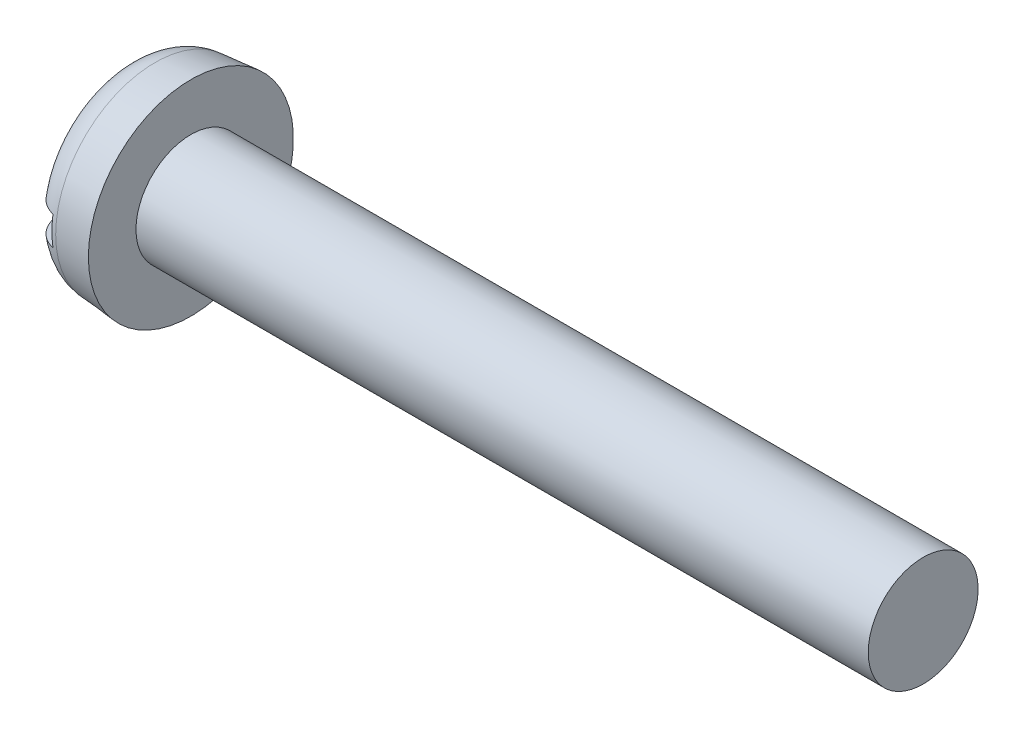
ISO-10303-21;
HEADER;
FILE_DESCRIPTION(('STEP AP214'),'2;1');
FILE_NAME('part.step','',(''),(''),'','','');
FILE_SCHEMA(('AUTOMOTIVE_DESIGN { 1 0 10303 214 1 1 1 1 }'));
ENDSEC;
DATA;
#1=APPLICATION_CONTEXT('core data for automotive mechanical design processes');
#2=APPLICATION_PROTOCOL_DEFINITION('international standard','automotive_design',2000,#1);
#3=PRODUCT_CONTEXT('',#1,'mechanical');
#4=PRODUCT('Part','Part','',(#3));
#5=PRODUCT_RELATED_PRODUCT_CATEGORY('part','',(#4));
#6=PRODUCT_DEFINITION_FORMATION('','',#4);
#7=PRODUCT_DEFINITION_CONTEXT('part definition',#1,'design');
#8=PRODUCT_DEFINITION('design','',#6,#7);
#9=PRODUCT_DEFINITION_SHAPE('','',#8);
#10=(LENGTH_UNIT() NAMED_UNIT(*) SI_UNIT(.MILLI.,.METRE.));
#11=(NAMED_UNIT(*) PLANE_ANGLE_UNIT() SI_UNIT($,.RADIAN.));
#12=(NAMED_UNIT(*) SI_UNIT($,.STERADIAN.) SOLID_ANGLE_UNIT());
#13=UNCERTAINTY_MEASURE_WITH_UNIT(LENGTH_MEASURE(1.E-05),#10,'distance_accuracy_value','');
#14=(GEOMETRIC_REPRESENTATION_CONTEXT(3) GLOBAL_UNCERTAINTY_ASSIGNED_CONTEXT((#13)) GLOBAL_UNIT_ASSIGNED_CONTEXT((#10,
#11,#12)) REPRESENTATION_CONTEXT('',''));
#15=CARTESIAN_POINT('',(0.,0.,0.));
#16=DIRECTION('',(0.,0.,1.));
#17=DIRECTION('',(1.,0.,0.));
#18=AXIS2_PLACEMENT_3D('',#15,#16,#17);
#19=CARTESIAN_POINT('',(0.,0.,0.));
#20=DIRECTION('',(-1.,0.,0.));
#21=DIRECTION('',(0.,0.,1.));
#22=AXIS2_PLACEMENT_3D('',#19,#20,#21);
#23=PLANE('',#22);
#24=DIRECTION('',(0.,0.,-1.));
#25=VECTOR('',#24,1.);
#26=CARTESIAN_POINT('',(0.,0.4,2.8));
#27=LINE('',#26,#25);
#28=CARTESIAN_POINT('',(0.,0.4,1.77326763142532));
#29=VERTEX_POINT('',#28);
#30=CARTESIAN_POINT('',(0.,0.4,-1.77326763142532));
#31=VERTEX_POINT('',#30);
#32=EDGE_CURVE('E87',#29,#31,#27,.T.);
#33=ORIENTED_EDGE('',*,*,#32,.F.);
#34=CARTESIAN_POINT('',(0.,0.,0.));
#35=DIRECTION('',(-1.,0.,0.));
#36=DIRECTION('',(0.,0.,1.));
#37=AXIS2_PLACEMENT_3D('',#34,#35,#36);
#38=CIRCLE('',#37,1.81782234903766);
#39=EDGE_CURVE('E93',#29,#31,#38,.T.);
#40=ORIENTED_EDGE('',*,*,#39,.T.);
#41=EDGE_LOOP('',(#33,#40));
#42=FACE_BOUND('',#41,.T.);
#43=ADVANCED_FACE('F34',(#42),#23,.T.);
#44=CARTESIAN_POINT('',(-25.4,0.,0.));
#45=DIRECTION('',(-1.,0.,0.));
#46=DIRECTION('',(0.,0.,1.));
#47=AXIS2_PLACEMENT_3D('',#44,#45,#46);
#48=CYLINDRICAL_SURFACE('',#47,1.5);
#49=CARTESIAN_POINT('',(21.8,0.,0.));
#50=DIRECTION('',(-1.,0.,0.));
#51=DIRECTION('',(0.,0.,1.));
#52=AXIS2_PLACEMENT_3D('',#49,#50,#51);
#53=CIRCLE('',#52,1.5);
#54=CARTESIAN_POINT('',(21.8,0.,1.5));
#55=VERTEX_POINT('',#54);
#56=EDGE_CURVE('E94',#55,#55,#53,.T.);
#57=ORIENTED_EDGE('',*,*,#56,.T.);
#58=EDGE_LOOP('',(#57));
#59=FACE_BOUND('',#58,.T.);
#60=CARTESIAN_POINT('',(1.8,0.,0.));
#61=DIRECTION('',(-1.,0.,0.));
#62=DIRECTION('',(0.,0.,1.));
#63=AXIS2_PLACEMENT_3D('',#60,#61,#62);
#64=CIRCLE('',#63,1.5);
#65=CARTESIAN_POINT('',(1.8,0.,1.5));
#66=VERTEX_POINT('',#65);
#67=EDGE_CURVE('E151',#66,#66,#64,.T.);
#68=ORIENTED_EDGE('',*,*,#67,.F.);
#69=EDGE_LOOP('',(#68));
#70=FACE_BOUND('',#69,.T.);
#71=ADVANCED_FACE('F139',(#59,#70),#48,.T.);
#72=CARTESIAN_POINT('',(21.8,1.5,0.));
#73=DIRECTION('',(1.,0.,0.));
#74=DIRECTION('',(0.,0.,-1.));
#75=AXIS2_PLACEMENT_3D('',#72,#73,#74);
#76=PLANE('',#75);
#77=ORIENTED_EDGE('',*,*,#56,.F.);
#78=EDGE_LOOP('',(#77));
#79=FACE_BOUND('',#78,.T.);
#80=ADVANCED_FACE('F137',(#79),#76,.T.);
#81=DIRECTION('',(0.,0.,1.));
#82=VECTOR('',#81,1.);
#83=CARTESIAN_POINT('',(0.,-0.4,-2.8));
#84=LINE('',#83,#82);
#85=CARTESIAN_POINT('',(0.,-0.4,-1.77326763142532));
#86=VERTEX_POINT('',#85);
#87=CARTESIAN_POINT('',(0.,-0.4,1.77326763142532));
#88=VERTEX_POINT('',#87);
#89=EDGE_CURVE('E78',#86,#88,#84,.T.);
#90=ORIENTED_EDGE('',*,*,#89,.F.);
#91=EDGE_CURVE('E85',#86,#88,#38,.T.);
#92=ORIENTED_EDGE('',*,*,#91,.T.);
#93=EDGE_LOOP('',(#90,#92));
#94=FACE_BOUND('',#93,.T.);
#95=ADVANCED_FACE('F84',(#94),#23,.T.);
#96=CARTESIAN_POINT('',(0.,0.,0.));
#97=DIRECTION('',(1.,0.,0.));
#98=DIRECTION('',(0.,0.,-1.));
#99=AXIS2_PLACEMENT_3D('',#96,#97,#98);
#100=CONICAL_SURFACE('',#99,2.64252040565334,0.0872664625997168);
#101=CARTESIAN_POINT('',(0.821559831527111,0.,0.));
#102=DIRECTION('',(-1.,0.,0.));
#103=DIRECTION('',(0.,0.,1.));
#104=AXIS2_PLACEMENT_3D('',#101,#102,#103);
#105=CIRCLE('',#104,2.71439757732023);
#106=CARTESIAN_POINT('',(0.821559831527111,0.,2.71439757732023));
#107=VERTEX_POINT('',#106);
#108=EDGE_CURVE('E97',#107,#107,#105,.F.);
#109=ORIENTED_EDGE('',*,*,#108,.T.);
#110=EDGE_LOOP('',(#109));
#111=FACE_BOUND('',#110,.T.);
#112=CARTESIAN_POINT('',(1.8,0.,0.));
#113=DIRECTION('',(-1.,0.,0.));
#114=DIRECTION('',(0.,0.,1.));
#115=AXIS2_PLACEMENT_3D('',#112,#113,#114);
#116=CIRCLE('',#115,2.8);
#117=CARTESIAN_POINT('',(1.8,0.,2.8));
#118=VERTEX_POINT('',#117);
#119=EDGE_CURVE('E99',#118,#118,#116,.T.);
#120=ORIENTED_EDGE('',*,*,#119,.T.);
#121=EDGE_LOOP('',(#120));
#122=FACE_BOUND('',#121,.T.);
#123=ADVANCED_FACE('F130',(#111,#122),#100,.T.);
#124=CARTESIAN_POINT('',(1.8,1.5,0.));
#125=DIRECTION('',(-1.,0.,0.));
#126=DIRECTION('',(0.,0.,1.));
#127=AXIS2_PLACEMENT_3D('',#124,#125,#126);
#128=PLANE('',#127);
#129=ORIENTED_EDGE('',*,*,#119,.F.);
#130=EDGE_LOOP('',(#129));
#131=FACE_BOUND('',#130,.T.);
#132=ORIENTED_EDGE('',*,*,#67,.T.);
#133=EDGE_LOOP('',(#132));
#134=FACE_BOUND('',#133,.T.);
#135=ADVANCED_FACE('F126',(#131,#134),#128,.F.);
#136=CARTESIAN_POINT('',(0.9,0.,0.));
#137=DIRECTION('',(-1.,0.,0.));
#138=DIRECTION('',(0.,0.,1.));
#139=AXIS2_PLACEMENT_3D('',#136,#137,#138);
#140=TOROIDAL_SURFACE('',#139,1.81782234903766,0.9);
#141=CARTESIAN_POINT('',(0.401696093511728,0.4,-2.53593152114129));
#142=CARTESIAN_POINT('',(0.443301117774009,0.4,-2.56393332788218));
#143=CARTESIAN_POINT('',(0.48728921147468,0.4,-2.58845843023252));
#144=CARTESIAN_POINT('',(0.578792425576941,0.4,-2.62980192456992));
#145=CARTESIAN_POINT('',(0.626311517541325,0.4,-2.64661148109401));
#146=CARTESIAN_POINT('',(0.723491694345221,0.4,-2.67199528317045));
#147=CARTESIAN_POINT('',(0.77315217005018,0.4,-2.6805718547261));
#148=CARTESIAN_POINT('',(0.873195470603058,0.4,-2.68923740018578));
#149=CARTESIAN_POINT('',(0.923578118909892,0.4,-2.68932841422142));
#150=CARTESIAN_POINT('',(1.02350797374872,0.4,-2.68103738118982));
#151=CARTESIAN_POINT('',(1.07305702227845,0.4,-2.67267751789981));
#152=CARTESIAN_POINT('',(1.17005159771854,0.4,-2.64776531442094));
#153=CARTESIAN_POINT('',(1.21749706154432,0.4,-2.63121272872072));
#154=CARTESIAN_POINT('',(1.30899463227735,0.4,-2.59038229907007));
#155=CARTESIAN_POINT('',(1.35304326494453,0.4,-2.5660966726896));
#156=CARTESIAN_POINT('',(1.43646971838795,0.4,-2.51051742624853));
#157=CARTESIAN_POINT('',(1.47584746170715,0.4,-2.47922368999777));
#158=CARTESIAN_POINT('',(1.54908472891299,0.4,-2.41032419236434));
#159=CARTESIAN_POINT('',(1.58290894495081,0.4,-2.37268091273685));
#160=CARTESIAN_POINT('',(1.64384285536696,0.4,-2.29230689336045));
#161=CARTESIAN_POINT('',(1.67095227126419,0.4,-2.24957594272072));
#162=CARTESIAN_POINT('',(1.71804431058735,0.4,-2.15971237578418));
#163=CARTESIAN_POINT('',(1.73793948776457,0.4,-2.11253395536871));
#164=CARTESIAN_POINT('',(1.76968090770725,0.4,-2.01554593245493));
#165=CARTESIAN_POINT('',(1.78152655521718,0.4,-1.96573613566218));
#166=CARTESIAN_POINT('',(1.79707863209083,0.4,-1.86394560462762));
#167=CARTESIAN_POINT('',(1.80063474217523,0.4,-1.81194193297292));
#168=CARTESIAN_POINT('',(1.79917918253395,0.4,-1.70805700113295));
#169=CARTESIAN_POINT('',(1.79416652473772,0.4,-1.65617575575555));
#170=CARTESIAN_POINT('',(1.7755943642346,0.4,-1.55269446133053));
#171=CARTESIAN_POINT('',(1.76183474132893,0.4,-1.50113034177219));
#172=CARTESIAN_POINT('',(1.72605722331735,0.4,-1.40095096381718));
#173=CARTESIAN_POINT('',(1.70403814128862,0.4,-1.35233613041373));
#174=CARTESIAN_POINT('',(1.65177086981811,0.4,-1.25824022538735));
#175=CARTESIAN_POINT('',(1.62134113345016,0.4,-1.21285988807693));
#176=CARTESIAN_POINT('',(1.55331109595649,0.4,-1.12780932458797));
#177=CARTESIAN_POINT('',(1.51570875984687,0.4,-1.08814072454133));
#178=CARTESIAN_POINT('',(1.43418773757712,0.4,-1.01571120097083));
#179=CARTESIAN_POINT('',(1.39025557046043,0.4,-0.982965398150426));
#180=CARTESIAN_POINT('',(1.29725173640542,0.4,-0.925820211344956));
#181=CARTESIAN_POINT('',(1.24818246394632,0.4,-0.901416961201436));
#182=CARTESIAN_POINT('',(1.1492196326343,0.4,-0.863395366502829));
#183=CARTESIAN_POINT('',(1.09953332116632,0.4,-0.849240526280142));
#184=CARTESIAN_POINT('',(0.998407326739823,0.4,-0.830450847570662));
#185=CARTESIAN_POINT('',(0.946969290105793,0.4,-0.825807308120568));
#186=CARTESIAN_POINT('',(0.84892872096548,0.4,-0.826338661096803));
#187=CARTESIAN_POINT('',(0.802319233875119,0.4,-0.830644672645143));
#188=CARTESIAN_POINT('',(0.710503550748047,0.4,-0.847082675101284));
#189=CARTESIAN_POINT('',(0.665297586491216,0.4,-0.859215951485934));
#190=CARTESIAN_POINT('',(0.577725921687515,0.4,-0.890561229701253));
#191=CARTESIAN_POINT('',(0.535345451357801,0.4,-0.909732336345551));
#192=CARTESIAN_POINT('',(0.454039585142496,0.4,-0.954356114786257));
#193=CARTESIAN_POINT('',(0.415115190169609,0.4,-0.979810598293163));
#194=CARTESIAN_POINT('',(0.338258283652574,0.4,-1.03863563377017));
#195=CARTESIAN_POINT('',(0.300704584388947,0.4,-1.07250127234658));
#196=CARTESIAN_POINT('',(0.231340396591253,0.4,-1.14567873524743));
#197=CARTESIAN_POINT('',(0.199531837361427,0.4,-1.1849923812911));
#198=CARTESIAN_POINT('',(0.140343537062657,0.4,-1.27100479329441));
#199=CARTESIAN_POINT('',(0.113435239263175,0.4,-1.31802904125808));
#200=CARTESIAN_POINT('',(0.0677697881199934,0.4,-1.41588613859262));
#201=CARTESIAN_POINT('',(0.0490135480549559,0.4,-1.466719413943));
#202=CARTESIAN_POINT('',(0.0200605085740848,0.4,-1.57150752749652));
#203=CARTESIAN_POINT('',(0.00998112078324489,0.4,-1.62549494001755));
#204=CARTESIAN_POINT('',(-0.000774459474645484,0.4,-1.73439964710515));
#205=CARTESIAN_POINT('',(-0.00145178031293717,0.4,-1.78931682929512));
#206=CARTESIAN_POINT('',(0.00665978805998371,0.4,-1.8973585349181));
#207=CARTESIAN_POINT('',(0.0152619165789972,0.4,-1.95049703954292));
#208=CARTESIAN_POINT('',(0.0415044362784365,0.4,-2.05451158025993));
#209=CARTESIAN_POINT('',(0.0591459771853456,0.4,-2.10538732765632));
#210=CARTESIAN_POINT('',(0.102479617855353,0.4,-2.20207106255329));
#211=CARTESIAN_POINT('',(0.127962009730159,0.4,-2.24797321246302));
#212=CARTESIAN_POINT('',(0.186405952526769,0.4,-2.3346826673761));
#213=CARTESIAN_POINT('',(0.219357119954585,0.4,-2.37549692488183));
#214=CARTESIAN_POINT('',(0.2776517991716,0.4,-2.43611780517026));
#215=CARTESIAN_POINT('',(0.300961246504243,0.4,-2.45791602542563));
#216=CARTESIAN_POINT('',(0.349758108963351,0.4,-2.49892172941219));
#217=CARTESIAN_POINT('',(0.375245501851939,0.4,-2.51812923959063));
#218=CARTESIAN_POINT('',(0.401696093511728,0.4,-2.53593152114129));
#219=B_SPLINE_CURVE_WITH_KNOTS('',3,(#141,#142,#143,#144,#145,#146,#147,#148,#149,#150,#151,
#152,#153,#154,#155,#156,#157,#158,#159,#160,#161,#162,#163,#164,#165,#166,#167,#168,#169,#170,
#171,#172,#173,#174,#175,#176,#177,#178,#179,#180,#181,#182,#183,#184,#185,#186,#187,#188,#189,
#190,#191,#192,#193,#194,#195,#196,#197,#198,#199,#200,#201,#202,#203,#204,#205,#206,#207,#208,
#209,#210,#211,#212,#213,#214,#215,#216,#217,#218),.UNSPECIFIED.,.T.,.F.,(4,2,2,2,2,2,2,2,2,2,2,
2,2,2,2,2,2,2,2,2,2,2,2,2,2,2,2,2,2,2,2,2,2,2,2,2,2,2,4),(0.,0.150335933494514,
0.300843597394242,0.451308726970357,0.601737681026104,0.751772777865598,0.901812371080131,
1.05200344195132,1.20219700308282,1.35331128753966,1.50443183806961,1.65732734739064,
1.81023416196794,1.96589285940572,2.1215695071664,2.28094272743601,2.44033885916066,
2.60348795607714,2.76668341009569,2.93023171311279,3.09370412047096,3.24783730341248,
3.40182942181944,3.5415702699926,3.68133407374162,3.82029827564248,3.95930259253055,
4.11036263383425,4.26147330942957,4.42325618279747,4.58505717610391,4.74901464634026,
4.9129524393615,5.07365129317271,5.23437059141101,5.39111839087745,5.54764959339694,
5.64322735248863,5.73880413580184),.UNSPECIFIED.);
#220=CARTESIAN_POINT('',(0.7,0.4,-2.66547244738019));
#221=VERTEX_POINT('',#220);
#222=EDGE_CURVE('E11',#31,#221,#219,.T.);
#223=ORIENTED_EDGE('',*,*,#222,.F.);
#224=ORIENTED_EDGE('',*,*,#39,.F.);
#225=CARTESIAN_POINT('',(0.631175220468883,0.4,0.871495981540627));
#226=CARTESIAN_POINT('',(0.674904543341188,0.4,0.856438796500031));
#227=CARTESIAN_POINT('',(0.719878263159747,0.4,0.844929838444239));
#228=CARTESIAN_POINT('',(0.811135722097473,0.4,0.829645582358335));
#229=CARTESIAN_POINT('',(0.857419653490011,0.4,0.82587142543657));
#230=CARTESIAN_POINT('',(0.949967657712768,0.4,0.826292946243278));
#231=CARTESIAN_POINT('',(0.996231718998188,0.4,0.830491246695725));
#232=CARTESIAN_POINT('',(1.08739120729822,0.4,0.846603737630664));
#233=CARTESIAN_POINT('',(1.13228633060722,0.4,0.858519627443414));
#234=CARTESIAN_POINT('',(1.21961165117638,0.4,0.889449471124122));
#235=CARTESIAN_POINT('',(1.26203829733493,0.4,0.908473372222466));
#236=CARTESIAN_POINT('',(1.34345634110222,0.4,0.952815473313927));
#237=CARTESIAN_POINT('',(1.38244667242382,0.4,0.978135617780085));
#238=CARTESIAN_POINT('',(1.4594377621541,0.4,1.03667706350997));
#239=CARTESIAN_POINT('',(1.49706398720202,0.4,1.07039108297028));
#240=CARTESIAN_POINT('',(1.56659895295035,0.4,1.14327535241885));
#241=CARTESIAN_POINT('',(1.59850581805068,0.4,1.18244738484377));
#242=CARTESIAN_POINT('',(1.65794109406934,0.4,1.26820361081833));
#243=CARTESIAN_POINT('',(1.68499616118368,0.4,1.31511693869777));
#244=CARTESIAN_POINT('',(1.73097615311023,0.4,1.41277630231542));
#245=CARTESIAN_POINT('',(1.74990014079754,0.4,1.46352277904048));
#246=CARTESIAN_POINT('',(1.77921631303595,0.4,1.56819037296415));
#247=CARTESIAN_POINT('',(1.78948692404479,0.4,1.62214568122431));
#248=CARTESIAN_POINT('',(1.80062989577949,0.4,1.73102148257415));
#249=CARTESIAN_POINT('',(1.80150300404476,0.4,1.78594189854469));
#250=CARTESIAN_POINT('',(1.79377570144154,0.4,1.89403950300678));
#251=CARTESIAN_POINT('',(1.78535947623962,0.4,1.94722981003804));
#252=CARTESIAN_POINT('',(1.75948035152466,0.4,2.05136420293336));
#253=CARTESIAN_POINT('',(1.74201866082191,0.4,2.10230858794919));
#254=CARTESIAN_POINT('',(1.69903294428936,0.4,2.1991365537311));
#255=CARTESIAN_POINT('',(1.67372338322898,0.4,2.24511537218269));
#256=CARTESIAN_POINT('',(1.61559302758182,0.4,2.33205182310155));
#257=CARTESIAN_POINT('',(1.58277310246186,0.4,2.37301003595672));
#258=CARTESIAN_POINT('',(1.51127974813898,0.4,2.44787841079591));
#259=CARTESIAN_POINT('',(1.47273752290481,0.4,2.48191390856888));
#260=CARTESIAN_POINT('',(1.39041996071933,0.4,2.54292499319193));
#261=CARTESIAN_POINT('',(1.34664504043414,0.4,2.5699011416151));
#262=CARTESIAN_POINT('',(1.25574182443869,0.4,2.61566191750627));
#263=CARTESIAN_POINT('',(1.20866632391598,0.4,2.63455146707593));
#264=CARTESIAN_POINT('',(1.11199802813735,0.4,2.66409285611721));
#265=CARTESIAN_POINT('',(1.06240535215686,0.4,2.67474508552361));
#266=CARTESIAN_POINT('',(0.962502526653357,0.4,2.68744471269732));
#267=CARTESIAN_POINT('',(0.912200346253432,0.4,2.68955487726819));
#268=CARTESIAN_POINT('',(0.811958811975336,0.4,2.68528081529453));
#269=CARTESIAN_POINT('',(0.762019450666034,0.4,2.67889676322146));
#270=CARTESIAN_POINT('',(0.664027531989639,0.4,2.65784627208927));
#271=CARTESIAN_POINT('',(0.615971279375599,0.4,2.643197022474));
#272=CARTESIAN_POINT('',(0.522990210676872,0.4,2.60606123058607));
#273=CARTESIAN_POINT('',(0.478065406672589,0.4,2.58357465808084));
#274=CARTESIAN_POINT('',(0.392472109536808,0.4,2.53134616302211));
#275=CARTESIAN_POINT('',(0.351816515703728,0.4,2.50158310815031));
#276=CARTESIAN_POINT('',(0.276029509997113,0.4,2.4357048513604));
#277=CARTESIAN_POINT('',(0.240898244430083,0.4,2.39958948126101));
#278=CARTESIAN_POINT('',(0.176835333350468,0.4,2.32172709740984));
#279=CARTESIAN_POINT('',(0.147956836829552,0.4,2.27993636985612));
#280=CARTESIAN_POINT('',(0.0975151321071609,0.4,2.19215427977415));
#281=CARTESIAN_POINT('',(0.0759523258739369,0.4,2.14616268660111));
#282=CARTESIAN_POINT('',(0.0404117526562702,0.4,2.05060031814039));
#283=CARTESIAN_POINT('',(0.0265449840419457,0.4,2.00098828619734));
#284=CARTESIAN_POINT('',(0.00715737687929584,0.4,1.90016214005584));
#285=CARTESIAN_POINT('',(0.00163730520276083,0.4,1.84894787909014));
#286=CARTESIAN_POINT('',(-0.00103646856464831,0.4,1.74525626284435));
#287=CARTESIAN_POINT('',(0.00198298502720431,0.4,1.692774471539));
#288=CARTESIAN_POINT('',(0.0165672576861163,0.4,1.5890162459782));
#289=CARTESIAN_POINT('',(0.0281327748436754,0.4,1.53773991054426));
#290=CARTESIAN_POINT('',(0.0597928723844844,0.4,1.43649219995258));
#291=CARTESIAN_POINT('',(0.0800919231210289,0.4,1.3865847552086));
#292=CARTESIAN_POINT('',(0.128628670781471,0.4,1.29076759544655));
#293=CARTESIAN_POINT('',(0.156870001205797,0.4,1.2448597228063));
#294=CARTESIAN_POINT('',(0.221149361739103,0.4,1.15746425330815));
#295=CARTESIAN_POINT('',(0.257329693538453,0.4,1.11608124200677));
#296=CARTESIAN_POINT('',(0.33619903186313,0.4,1.04011285475969));
#297=CARTESIAN_POINT('',(0.378880772489415,0.4,1.00551998779309));
#298=CARTESIAN_POINT('',(0.456345744826249,0.4,0.953377181098868));
#299=CARTESIAN_POINT('',(0.489781510585734,0.4,0.933802963989649));
#300=CARTESIAN_POINT('',(0.558913558209207,0.4,0.899158166013482));
#301=CARTESIAN_POINT('',(0.594609343085406,0.4,0.884086599134742));
#302=CARTESIAN_POINT('',(0.631175220468883,0.4,0.871495981540627));
#303=B_SPLINE_CURVE_WITH_KNOTS('',3,(#225,#226,#227,#228,#229,#230,#231,#232,#233,#234,#235,
#236,#237,#238,#239,#240,#241,#242,#243,#244,#245,#246,#247,#248,#249,#250,#251,#252,#253,#254,
#255,#256,#257,#258,#259,#260,#261,#262,#263,#264,#265,#266,#267,#268,#269,#270,#271,#272,#273,
#274,#275,#276,#277,#278,#279,#280,#281,#282,#283,#284,#285,#286,#287,#288,#289,#290,#291,#292,
#293,#294,#295,#296,#297,#298,#299,#300,#301,#302),.UNSPECIFIED.,.T.,.F.,(4,2,2,2,2,2,2,2,2,2,2,
2,2,2,2,2,2,2,2,2,2,2,2,2,2,2,2,2,2,2,2,2,2,2,2,2,2,2,4),(0.,0.138615612916103,
0.277251674198893,0.415933350916858,0.554645574236207,0.693552648422647,0.832502674767945,
0.983421485118331,1.13438969741741,1.29610427307938,1.45783748170807,1.62180673071881,
1.78576293643649,1.94652574714201,2.10726707950299,2.2639540446038,2.42062287939072,
2.57413636036031,2.72763762557716,2.87908198292273,3.03051917082038,3.18084156107108,
3.33116086374289,3.4811686879926,3.63117709090574,3.78162643331956,3.93207975956823,
4.08376569017546,4.23545995397545,4.38928870771081,4.54313159395465,4.70011617891189,
4.85711358867004,5.01800577434983,5.17897168640495,5.34310060642745,5.50704742574204,
5.62298136153755,5.73888989092701),.UNSPECIFIED.);
#304=CARTESIAN_POINT('',(0.7,0.4,2.66547244738019));
#305=VERTEX_POINT('',#304);
#306=EDGE_CURVE('E111',#305,#29,#303,.T.);
#307=ORIENTED_EDGE('',*,*,#306,.F.);
#308=CARTESIAN_POINT('',(0.7,0.,0.));
#309=DIRECTION('',(-1.,0.,0.));
#310=DIRECTION('',(0.,0.,1.));
#311=AXIS2_PLACEMENT_3D('',#308,#309,#310);
#312=CIRCLE('',#311,2.69531878777687);
#313=CARTESIAN_POINT('',(0.7,-0.4,2.66547244738019));
#314=VERTEX_POINT('',#313);
#315=EDGE_CURVE('E105',#305,#314,#312,.F.);
#316=ORIENTED_EDGE('',*,*,#315,.T.);
#317=CARTESIAN_POINT('',(0.631175220468883,-0.4,0.871495981540627));
#318=CARTESIAN_POINT('',(0.582440056051627,-0.4,0.888281741940888));
#319=CARTESIAN_POINT('',(0.535174963055644,-0.4,0.909503716497946));
#320=CARTESIAN_POINT('',(0.444903467512748,-0.4,0.959728629210835));
#321=CARTESIAN_POINT('',(0.401907569369314,-0.4,0.988750138784298));
#322=CARTESIAN_POINT('',(0.32139933187422,-0.4,1.05330679583531));
#323=CARTESIAN_POINT('',(0.283866824101226,-0.4,1.08881683540862));
#324=CARTESIAN_POINT('',(0.214947035166147,-0.4,1.16532583126717));
#325=CARTESIAN_POINT('',(0.183557026279774,-0.4,1.20632233747312));
#326=CARTESIAN_POINT('',(0.126173306630207,-0.4,1.29499806178717));
#327=CARTESIAN_POINT('',(0.100543812186154,-0.4,1.34291357063032));
#328=CARTESIAN_POINT('',(0.0575990442880277,-0.4,1.44234685085245));
#329=CARTESIAN_POINT('',(0.0402853165841816,-0.4,1.4938652899135));
#330=CARTESIAN_POINT('',(0.0144295468099868,-0.4,1.59957722380881));
#331=CARTESIAN_POINT('',(0.00597091020770669,-0.4,1.65379120331088));
#332=CARTESIAN_POINT('',(-0.00151505119498231,-0.4,1.76286943896087));
#333=CARTESIAN_POINT('',(-0.000543260661566268,-0.4,1.81773363362998));
#334=CARTESIAN_POINT('',(0.0108063117868816,-0.4,1.92531903415647));
#335=CARTESIAN_POINT('',(0.0209864254781905,-0.4,1.97806105250491));
#336=CARTESIAN_POINT('',(0.0502872770681116,-0.4,2.08100191154855));
#337=CARTESIAN_POINT('',(0.0694067748926924,-0.4,2.13120110391516));
#338=CARTESIAN_POINT('',(0.115513806824551,-0.4,2.22629801812597));
#339=CARTESIAN_POINT('',(0.14229288611334,-0.4,2.27129684027619));
#340=CARTESIAN_POINT('',(0.203167661896693,-0.4,2.35603997582291));
#341=CARTESIAN_POINT('',(0.237262555060448,-0.4,2.39578486536653));
#342=CARTESIAN_POINT('',(0.31107215015185,-0.4,2.46808210682477));
#343=CARTESIAN_POINT('',(0.350664393955093,-0.4,2.50075952492731));
#344=CARTESIAN_POINT('',(0.43483240572609,-0.4,2.55890052234819));
#345=CARTESIAN_POINT('',(0.479407789016665,-0.4,2.5843646579657));
#346=CARTESIAN_POINT('',(0.571659032279254,-0.4,2.62702917155574));
#347=CARTESIAN_POINT('',(0.61928802255602,-0.4,2.64433093880064));
#348=CARTESIAN_POINT('',(0.716785744822632,-0.4,2.67063086398603));
#349=CARTESIAN_POINT('',(0.766654377625563,-0.4,2.67962938927216));
#350=CARTESIAN_POINT('',(0.866851086765478,-0.4,2.68902063968356));
#351=CARTESIAN_POINT('',(0.917173710289189,-0.4,2.68947163706794));
#352=CARTESIAN_POINT('',(1.01717730229027,-0.4,2.68190382365889));
#353=CARTESIAN_POINT('',(1.06685828235616,-0.4,2.67388516605054));
#354=CARTESIAN_POINT('',(1.16408913364714,-0.4,2.64963561785688));
#355=CARTESIAN_POINT('',(1.21164224901621,-0.4,2.63341772685543));
#356=CARTESIAN_POINT('',(1.30336357324319,-0.4,2.5932548985632));
#357=CARTESIAN_POINT('',(1.34753176252252,-0.4,2.56930991658271));
#358=CARTESIAN_POINT('',(1.43140121230963,-0.4,2.51429882511239));
#359=CARTESIAN_POINT('',(1.47108662202344,-0.4,2.48320855787322));
#360=CARTESIAN_POINT('',(1.54472936336671,-0.4,2.41485918396244));
#361=CARTESIAN_POINT('',(1.57868652408327,-0.4,2.37759989329229));
#362=CARTESIAN_POINT('',(1.64024044205203,-0.4,2.29763356977095));
#363=CARTESIAN_POINT('',(1.66777905671271,-0.4,2.2548817982485));
#364=CARTESIAN_POINT('',(1.71540533966796,-0.4,2.16541487025925));
#365=CARTESIAN_POINT('',(1.73549258796614,-0.4,2.11869949056591));
#366=CARTESIAN_POINT('',(1.76797944190081,-0.4,2.02190542768205));
#367=CARTESIAN_POINT('',(1.78026184844694,-0.4,1.97178743470805));
#368=CARTESIAN_POINT('',(1.79642443017794,-0.4,1.87021727726405));
#369=CARTESIAN_POINT('',(1.80030382576996,-0.4,1.81876498945237));
#370=CARTESIAN_POINT('',(1.79965225810416,-0.4,1.71483495243173));
#371=CARTESIAN_POINT('',(1.79494304519989,-0.4,1.66235834857244));
#372=CARTESIAN_POINT('',(1.77700429154566,-0.4,1.55888409709202));
#373=CARTESIAN_POINT('',(1.76377367047763,-0.4,1.50788663784912));
#374=CARTESIAN_POINT('',(1.72880303252309,-0.4,1.40746214507163));
#375=CARTESIAN_POINT('',(1.7068583172022,-0.4,1.35810636780321));
#376=CARTESIAN_POINT('',(1.6551362081094,-0.4,1.2636760290119));
#377=CARTESIAN_POINT('',(1.62535713115486,-0.4,1.21860239032601));
#378=CARTESIAN_POINT('',(1.55817582249343,-0.4,1.13325277423327));
#379=CARTESIAN_POINT('',(1.52065002148733,-0.4,1.09307386688499));
#380=CARTESIAN_POINT('',(1.43925099604233,-0.4,1.01972901550195));
#381=CARTESIAN_POINT('',(1.39537733695676,-0.4,0.986563552070545));
#382=CARTESIAN_POINT('',(1.30343025383384,-0.4,0.929222350042134));
#383=CARTESIAN_POINT('',(1.25547156560025,-0.4,0.904863533629853));
#384=CARTESIAN_POINT('',(1.15587516450286,-0.4,0.865408006374134));
#385=CARTESIAN_POINT('',(1.10423998181313,-0.4,0.850304993129927));
#386=CARTESIAN_POINT('',(1.00351728354306,-0.4,0.831235729727251));
#387=CARTESIAN_POINT('',(0.954588162116058,-0.4,0.826429393731615));
#388=CARTESIAN_POINT('',(0.856720563885967,-0.4,0.825757597618513));
#389=CARTESIAN_POINT('',(0.80778225521716,-0.4,0.8298764112406));
#390=CARTESIAN_POINT('',(0.737839755845568,-0.4,0.842103164129609));
#391=CARTESIAN_POINT('',(0.716186869313665,-0.4,0.846800488735406));
#392=CARTESIAN_POINT('',(0.673323995455611,-0.4,0.857891117601622));
#393=CARTESIAN_POINT('',(0.652113925657395,-0.4,0.86428410295996));
#394=CARTESIAN_POINT('',(0.631175220468883,-0.4,0.871495981540627));
#395=B_SPLINE_CURVE_WITH_KNOTS('',3,(#317,#318,#319,#320,#321,#322,#323,#324,#325,#326,#327,
#328,#329,#330,#331,#332,#333,#334,#335,#336,#337,#338,#339,#340,#341,#342,#343,#344,#345,#346,
#347,#348,#349,#350,#351,#352,#353,#354,#355,#356,#357,#358,#359,#360,#361,#362,#363,#364,#365,
#366,#367,#368,#369,#370,#371,#372,#373,#374,#375,#376,#377,#378,#379,#380,#381,#382,#383,#384,
#385,#386,#387,#388,#389,#390,#391,#392,#393,#394),.UNSPECIFIED.,.T.,.F.,(4,2,2,2,2,2,2,2,2,2,2,
2,2,2,2,2,2,2,2,2,2,2,2,2,2,2,2,2,2,2,2,2,2,2,2,2,2,2,4),(0.,0.154545929505514,
0.309463158544145,0.463793151236126,0.618054453677577,0.780314715588444,0.942605127077751,
1.10641075199289,1.27020101048904,1.43055663497239,1.59089002147255,1.74721863073234,
1.90353008272413,2.05679554725431,2.2100491885017,2.3613455070347,2.51263513171131,
2.66289297461213,2.81314809994484,2.96316574487772,3.11318425745476,3.26371763526343,
3.41425550371989,3.56610818035137,3.71796941486144,3.87206025933959,4.02616539904814,
4.18350533199931,4.3408652159535,4.50216376271748,4.66349699219782,4.82763600715278,
4.99178626625811,5.15229563882414,5.31269559661531,5.45941323508264,5.6058725648985,
5.67228456882568,5.73868409152545),.UNSPECIFIED.);
#396=EDGE_CURVE('E92',#88,#314,#395,.T.);
#397=ORIENTED_EDGE('',*,*,#396,.F.);
#398=ORIENTED_EDGE('',*,*,#91,.F.);
#399=CARTESIAN_POINT('',(0.401696093511728,-0.4,-2.53593152114129));
#400=CARTESIAN_POINT('',(0.359499569861718,-0.4,-2.50752594853869));
#401=CARTESIAN_POINT('',(0.319690458635452,-0.4,-2.47549983982046));
#402=CARTESIAN_POINT('',(0.246006645656666,-0.4,-2.40516587836491));
#403=CARTESIAN_POINT('',(0.212140132740978,-0.4,-2.36684949616946));
#404=CARTESIAN_POINT('',(0.151336229791143,-0.4,-2.28512812362888));
#405=CARTESIAN_POINT('',(0.124391330893495,-0.4,-2.24172872264131));
#406=CARTESIAN_POINT('',(0.0780875903765085,-0.4,-2.15107708021563));
#407=CARTESIAN_POINT('',(0.0587267801703001,-0.4,-2.10382584244335));
#408=CARTESIAN_POINT('',(0.0278574989581019,-0.4,-2.00623443962711));
#409=CARTESIAN_POINT('',(0.016440901453291,-0.4,-1.95586524023863));
#410=CARTESIAN_POINT('',(0.00203581031766626,-0.4,-1.85393618870856));
#411=CARTESIAN_POINT('',(-0.000951523403916868,-0.4,-1.80237617368877));
#412=CARTESIAN_POINT('',(0.00150541182221353,-0.4,-1.69835894015113));
#413=CARTESIAN_POINT('',(0.00713078743956859,-0.4,-1.64590602749594));
#414=CARTESIAN_POINT('',(0.0268851706508874,-0.4,-1.54262865024755));
#415=CARTESIAN_POINT('',(0.0410152341853257,-0.4,-1.49180438869281));
#416=CARTESIAN_POINT('',(0.0777693985439923,-0.4,-1.39187524119994));
#417=CARTESIAN_POINT('',(0.100597428420281,-0.4,-1.34284532896703));
#418=CARTESIAN_POINT('',(0.154028665500749,-0.4,-1.24921236961778));
#419=CARTESIAN_POINT('',(0.184633577370676,-0.4,-1.20461029605316));
#420=CARTESIAN_POINT('',(0.253369835088766,-0.4,-1.12040413132917));
#421=CARTESIAN_POINT('',(0.291615661801268,-0.4,-1.08089328983157));
#422=CARTESIAN_POINT('',(0.374350758887981,-0.4,-1.00902344925026));
#423=CARTESIAN_POINT('',(0.418840522733276,-0.4,-0.976665015956932));
#424=CARTESIAN_POINT('',(0.511731904475918,-0.4,-0.921153761550259));
#425=CARTESIAN_POINT('',(0.56000602416032,-0.4,-0.897788688316841));
#426=CARTESIAN_POINT('',(0.660033558527157,-0.4,-0.860397113393027));
#427=CARTESIAN_POINT('',(0.711783369409339,-0.4,-0.846361098476873));
#428=CARTESIAN_POINT('',(0.812389224940536,-0.4,-0.829368295388297));
#429=CARTESIAN_POINT('',(0.861099258735353,-0.4,-0.825545352440831));
#430=CARTESIAN_POINT('',(0.958405899151309,-0.4,-0.826719597327248));
#431=CARTESIAN_POINT('',(1.00700253299767,-0.4,-0.831714388722303));
#432=CARTESIAN_POINT('',(1.0996760197852,-0.4,-0.84962330141339));
#433=CARTESIAN_POINT('',(1.14384950549969,-0.4,-0.862046867571478));
#434=CARTESIAN_POINT('',(1.22966211525765,-0.4,-0.89374221784771));
#435=CARTESIAN_POINT('',(1.27130051154861,-0.4,-0.913015957700824));
#436=CARTESIAN_POINT('',(1.35338723347829,-0.4,-0.958876506944367));
#437=CARTESIAN_POINT('',(1.39364158740159,-0.4,-0.985809526360112));
#438=CARTESIAN_POINT('',(1.46954671268381,-0.4,-1.04552244383327));
#439=CARTESIAN_POINT('',(1.50519595694897,-0.4,-1.07830427286891));
#440=CARTESIAN_POINT('',(1.5741481223088,-0.4,-1.15198864954587));
#441=CARTESIAN_POINT('',(1.60695638421133,-0.4,-1.19335517911256));
#442=CARTESIAN_POINT('',(1.66548530867698,-0.4,-1.28083525691765));
#443=CARTESIAN_POINT('',(1.69120428590284,-0.4,-1.32694993036066));
#444=CARTESIAN_POINT('',(1.73572700911521,-0.4,-1.42462801939109));
#445=CARTESIAN_POINT('',(1.75421770319601,-0.4,-1.47633466387386));
#446=CARTESIAN_POINT('',(1.78217546204147,-0.4,-1.58213636524115));
#447=CARTESIAN_POINT('',(1.79164262802123,-0.4,-1.63623139532851));
#448=CARTESIAN_POINT('',(1.80111834789599,-0.4,-1.74478524431538));
#449=CARTESIAN_POINT('',(1.80120671421375,-0.4,-1.79923704907971));
#450=CARTESIAN_POINT('',(1.79199564422116,-0.4,-1.90734333327446));
#451=CARTESIAN_POINT('',(1.78269735807886,-0.4,-1.96099790957378));
#452=CARTESIAN_POINT('',(1.75522804290983,-0.4,-2.06455754692508));
#453=CARTESIAN_POINT('',(1.73728348499548,-0.4,-2.11452267850709));
#454=CARTESIAN_POINT('',(1.69306568307316,-0.4,-2.21062233517153));
#455=CARTESIAN_POINT('',(1.66679349701772,-0.4,-2.25675734589841));
#456=CARTESIAN_POINT('',(1.60733395224623,-0.4,-2.34276585756036));
#457=CARTESIAN_POINT('',(1.57431956056638,-0.4,-2.38275897803032));
#458=CARTESIAN_POINT('',(1.50194333073533,-0.4,-2.45651788071981));
#459=CARTESIAN_POINT('',(1.46258208977932,-0.4,-2.49028424819412));
#460=CARTESIAN_POINT('',(1.37933549559489,-0.4,-2.55005790908044));
#461=CARTESIAN_POINT('',(1.33553510744259,-0.4,-2.57618357878773));
#462=CARTESIAN_POINT('',(1.24413819843943,-0.4,-2.62062313067504));
#463=CARTESIAN_POINT('',(1.19654207131845,-0.4,-2.63893782183569));
#464=CARTESIAN_POINT('',(1.09942378961358,-0.4,-2.66705979300267));
#465=CARTESIAN_POINT('',(1.0499260157382,-0.4,-2.67695133394454));
#466=CARTESIAN_POINT('',(0.949957006468675,-0.4,-2.68824503862299));
#467=CARTESIAN_POINT('',(0.899485546015457,-0.4,-2.6896452154879));
#468=CARTESIAN_POINT('',(0.799232995516733,-0.4,-2.68392343190627));
#469=CARTESIAN_POINT('',(0.749449974424365,-0.4,-2.67683486710842));
#470=CARTESIAN_POINT('',(0.651826495741724,-0.4,-2.65440372943721));
#471=CARTESIAN_POINT('',(0.603983614927445,-0.4,-2.63907181676455));
#472=CARTESIAN_POINT('',(0.530466612644572,-0.4,-2.60850240808469));
#473=CARTESIAN_POINT('',(0.503717386474933,-0.4,-2.59578274416443));
#474=CARTESIAN_POINT('',(0.45160806054978,-0.4,-2.56776112348693));
#475=CARTESIAN_POINT('',(0.426247954611343,-0.4,-2.55245917822458));
#476=CARTESIAN_POINT('',(0.401696093511728,-0.4,-2.53593152114129));
#477=B_SPLINE_CURVE_WITH_KNOTS('',3,(#399,#400,#401,#402,#403,#404,#405,#406,#407,#408,#409,
#410,#411,#412,#413,#414,#415,#416,#417,#418,#419,#420,#421,#422,#423,#424,#425,#426,#427,#428,
#429,#430,#431,#432,#433,#434,#435,#436,#437,#438,#439,#440,#441,#442,#443,#444,#445,#446,#447,
#448,#449,#450,#451,#452,#453,#454,#455,#456,#457,#458,#459,#460,#461,#462,#463,#464,#465,#466,
#467,#468,#469,#470,#471,#472,#473,#474,#475,#476),.UNSPECIFIED.,.T.,.F.,(4,2,2,2,2,2,2,2,2,2,2,
2,2,2,2,2,2,2,2,2,2,2,2,2,2,2,2,2,2,2,2,2,2,2,2,2,2,2,4),(0.,0.152490218607282,
0.305188944540641,0.457721310022948,0.610214056704589,0.764442291671228,0.91869174818651,
1.07622956938612,1.23378695448846,1.39529155818188,1.55683159371206,1.72100303477019,
1.88518745794618,2.0452166605768,2.2050824234249,2.3508822697905,2.49664249751799,
2.63370136587138,2.77079939621414,2.91549848817681,3.06024544108867,3.21793237831143,
3.37565677021802,3.539607260158,3.70355591107663,3.86610926645174,4.02864270620865,
4.18713298434998,4.34560313574806,4.5004280819907,4.65523846875457,4.80750509346896,
4.95975594414436,5.11046523737449,5.26120979331062,5.41136324663485,5.5613229886773,
5.65004914448151,5.73877490533682),.UNSPECIFIED.);
#478=CARTESIAN_POINT('',(0.7,-0.4,-2.66547244738019));
#479=VERTEX_POINT('',#478);
#480=EDGE_CURVE('E46',#479,#86,#477,.T.);
#481=ORIENTED_EDGE('',*,*,#480,.F.);
#482=EDGE_CURVE('E58',#479,#221,#312,.F.);
#483=ORIENTED_EDGE('',*,*,#482,.T.);
#484=EDGE_LOOP('',(#223,#224,#307,#316,#397,#398,#481,#483));
#485=FACE_BOUND('',#484,.T.);
#486=ORIENTED_EDGE('',*,*,#108,.F.);
#487=EDGE_LOOP('',(#486));
#488=FACE_BOUND('',#487,.T.);
#489=ADVANCED_FACE('F36',(#485,#488),#140,.T.);
#490=CARTESIAN_POINT('',(0.7,0.4,2.8));
#491=DIRECTION('',(0.,1.,0.));
#492=DIRECTION('',(0.,0.,1.));
#493=AXIS2_PLACEMENT_3D('',#490,#491,#492);
#494=PLANE('',#493);
#495=ORIENTED_EDGE('',*,*,#222,.T.);
#496=DIRECTION('',(0.,0.,-1.));
#497=VECTOR('',#496,1.);
#498=CARTESIAN_POINT('',(0.7,0.4,2.8));
#499=LINE('',#498,#497);
#500=EDGE_CURVE('E86',#305,#221,#499,.T.);
#501=ORIENTED_EDGE('',*,*,#500,.F.);
#502=ORIENTED_EDGE('',*,*,#306,.T.);
#503=ORIENTED_EDGE('',*,*,#32,.T.);
#504=EDGE_LOOP('',(#495,#501,#502,#503));
#505=FACE_BOUND('',#504,.T.);
#506=ADVANCED_FACE('F118',(#505),#494,.F.);
#507=CARTESIAN_POINT('',(0.7,-0.4,-2.8));
#508=DIRECTION('',(0.,-1.,0.));
#509=DIRECTION('',(0.,0.,-1.));
#510=AXIS2_PLACEMENT_3D('',#507,#508,#509);
#511=PLANE('',#510);
#512=ORIENTED_EDGE('',*,*,#480,.T.);
#513=ORIENTED_EDGE('',*,*,#89,.T.);
#514=ORIENTED_EDGE('',*,*,#396,.T.);
#515=DIRECTION('',(0.,0.,1.));
#516=VECTOR('',#515,1.);
#517=CARTESIAN_POINT('',(0.7,-0.4,-2.8));
#518=LINE('',#517,#516);
#519=EDGE_CURVE('E53',#479,#314,#518,.T.);
#520=ORIENTED_EDGE('',*,*,#519,.F.);
#521=EDGE_LOOP('',(#512,#513,#514,#520));
#522=FACE_BOUND('',#521,.T.);
#523=ADVANCED_FACE('F77',(#522),#511,.F.);
#524=CARTESIAN_POINT('',(0.7,0.4,-2.8));
#525=DIRECTION('',(-1.,0.,0.));
#526=DIRECTION('',(0.,0.,1.));
#527=AXIS2_PLACEMENT_3D('',#524,#525,#526);
#528=PLANE('',#527);
#529=ORIENTED_EDGE('',*,*,#519,.T.);
#530=ORIENTED_EDGE('',*,*,#315,.F.);
#531=ORIENTED_EDGE('',*,*,#500,.T.);
#532=ORIENTED_EDGE('',*,*,#482,.F.);
#533=EDGE_LOOP('',(#529,#530,#531,#532));
#534=FACE_BOUND('',#533,.T.);
#535=ADVANCED_FACE('F117',(#534),#528,.T.);
#536=CLOSED_SHELL('',(#43,#71,#80,#95,#123,#135,#489,#506,#523,#535));
#537=MANIFOLD_SOLID_BREP('B2',#536);
#538=ADVANCED_BREP_SHAPE_REPRESENTATION('',(#18,#537),#14);
#539=SHAPE_DEFINITION_REPRESENTATION(#9,#538);
ENDSEC;
END-ISO-10303-21;
